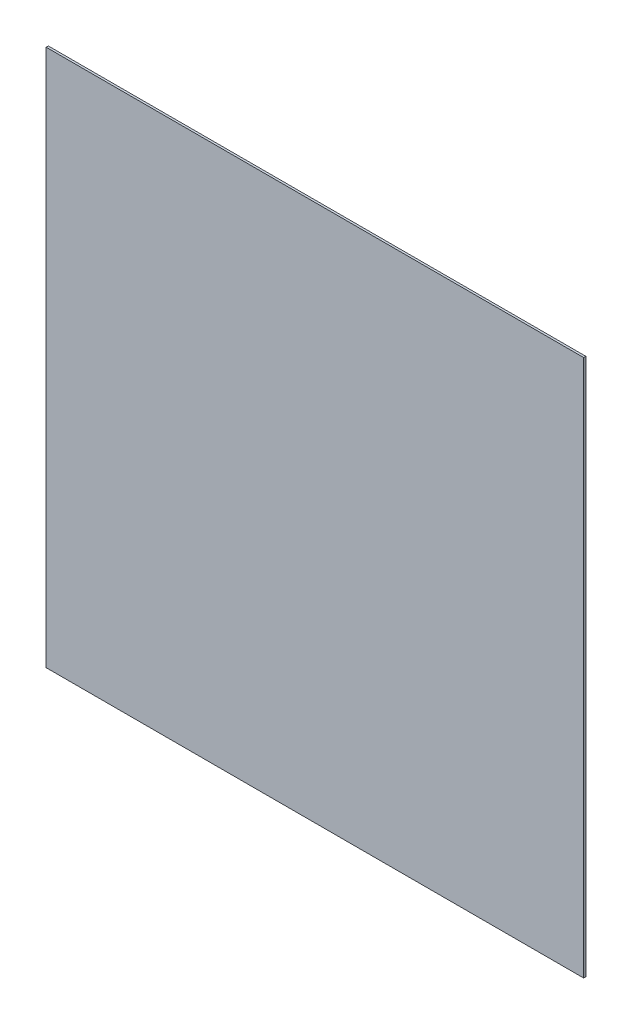
ISO-10303-21;
HEADER;
FILE_DESCRIPTION(('STEP AP214'),'2;1');
FILE_NAME('part.step','',(''),(''),'','','');
FILE_SCHEMA(('AUTOMOTIVE_DESIGN { 1 0 10303 214 1 1 1 1 }'));
ENDSEC;
DATA;
#1=APPLICATION_CONTEXT('core data for automotive mechanical design processes');
#2=APPLICATION_PROTOCOL_DEFINITION('international standard','automotive_design',2000,#1);
#3=PRODUCT_CONTEXT('',#1,'mechanical');
#4=PRODUCT('Part','Part','',(#3));
#5=PRODUCT_RELATED_PRODUCT_CATEGORY('part','',(#4));
#6=PRODUCT_DEFINITION_FORMATION('','',#4);
#7=PRODUCT_DEFINITION_CONTEXT('part definition',#1,'design');
#8=PRODUCT_DEFINITION('design','',#6,#7);
#9=PRODUCT_DEFINITION_SHAPE('','',#8);
#10=(LENGTH_UNIT() NAMED_UNIT(*) SI_UNIT(.MILLI.,.METRE.));
#11=(NAMED_UNIT(*) PLANE_ANGLE_UNIT() SI_UNIT($,.RADIAN.));
#12=(NAMED_UNIT(*) SI_UNIT($,.STERADIAN.) SOLID_ANGLE_UNIT());
#13=UNCERTAINTY_MEASURE_WITH_UNIT(LENGTH_MEASURE(1.E-05),#10,'distance_accuracy_value','');
#14=(GEOMETRIC_REPRESENTATION_CONTEXT(3) GLOBAL_UNCERTAINTY_ASSIGNED_CONTEXT((#13)) GLOBAL_UNIT_ASSIGNED_CONTEXT((#10,
#11,#12)) REPRESENTATION_CONTEXT('',''));
#15=CARTESIAN_POINT('',(0.,0.,0.));
#16=DIRECTION('',(0.,0.,1.));
#17=DIRECTION('',(1.,0.,0.));
#18=AXIS2_PLACEMENT_3D('',#15,#16,#17);
#19=CARTESIAN_POINT('',(-256.013393359467,248.,90.));
#20=DIRECTION('',(0.,1.,0.));
#21=DIRECTION('',(0.,0.,1.));
#22=AXIS2_PLACEMENT_3D('',#19,#20,#21);
#23=PLANE('',#22);
#24=DIRECTION('',(1.,0.,0.));
#25=VECTOR('',#24,1.);
#26=CARTESIAN_POINT('',(0.,248.,88.));
#27=LINE('',#26,#25);
#28=CARTESIAN_POINT('',(-248.,248.,88.));
#29=VERTEX_POINT('',#28);
#30=CARTESIAN_POINT('',(248.,248.,88.));
#31=VERTEX_POINT('',#30);
#32=EDGE_CURVE('E77',#29,#31,#27,.T.);
#33=ORIENTED_EDGE('',*,*,#32,.F.);
#34=DIRECTION('',(0.,0.,1.));
#35=VECTOR('',#34,1.);
#36=CARTESIAN_POINT('',(-248.,248.,-133.832293437024));
#37=LINE('',#36,#35);
#38=CARTESIAN_POINT('',(-248.,248.,90.));
#39=VERTEX_POINT('',#38);
#40=EDGE_CURVE('E35',#29,#39,#37,.T.);
#41=ORIENTED_EDGE('',*,*,#40,.T.);
#42=DIRECTION('',(1.,0.,0.));
#43=VECTOR('',#42,1.);
#44=CARTESIAN_POINT('',(-250.,248.,90.));
#45=LINE('',#44,#43);
#46=CARTESIAN_POINT('',(248.,248.,90.));
#47=VERTEX_POINT('',#46);
#48=EDGE_CURVE('E95',#39,#47,#45,.T.);
#49=ORIENTED_EDGE('',*,*,#48,.T.);
#50=DIRECTION('',(0.,0.,-1.));
#51=VECTOR('',#50,1.);
#52=CARTESIAN_POINT('',(248.,248.,-133.832293437024));
#53=LINE('',#52,#51);
#54=EDGE_CURVE('E81',#47,#31,#53,.T.);
#55=ORIENTED_EDGE('',*,*,#54,.T.);
#56=EDGE_LOOP('',(#33,#41,#49,#55));
#57=FACE_BOUND('',#56,.T.);
#58=ADVANCED_FACE('F32',(#57),#23,.T.);
#59=CARTESIAN_POINT('',(-301.446567486664,-248.,90.));
#60=DIRECTION('',(0.,-1.,0.));
#61=DIRECTION('',(0.,0.,-1.));
#62=AXIS2_PLACEMENT_3D('',#59,#60,#61);
#63=PLANE('',#62);
#64=DIRECTION('',(0.,0.,-1.));
#65=VECTOR('',#64,1.);
#66=CARTESIAN_POINT('',(-248.,-248.,-133.832293437024));
#67=LINE('',#66,#65);
#68=CARTESIAN_POINT('',(-248.,-248.,90.));
#69=VERTEX_POINT('',#68);
#70=CARTESIAN_POINT('',(-248.,-248.,88.));
#71=VERTEX_POINT('',#70);
#72=EDGE_CURVE('E85',#69,#71,#67,.T.);
#73=ORIENTED_EDGE('',*,*,#72,.T.);
#74=DIRECTION('',(1.,0.,0.));
#75=VECTOR('',#74,1.);
#76=CARTESIAN_POINT('',(0.,-248.,88.));
#77=LINE('',#76,#75);
#78=CARTESIAN_POINT('',(248.,-248.,88.));
#79=VERTEX_POINT('',#78);
#80=EDGE_CURVE('E11',#71,#79,#77,.T.);
#81=ORIENTED_EDGE('',*,*,#80,.T.);
#82=DIRECTION('',(0.,0.,1.));
#83=VECTOR('',#82,1.);
#84=CARTESIAN_POINT('',(248.,-248.,-133.832293437024));
#85=LINE('',#84,#83);
#86=CARTESIAN_POINT('',(248.,-248.,90.));
#87=VERTEX_POINT('',#86);
#88=EDGE_CURVE('E97',#79,#87,#85,.T.);
#89=ORIENTED_EDGE('',*,*,#88,.T.);
#90=DIRECTION('',(-1.,0.,0.));
#91=VECTOR('',#90,1.);
#92=CARTESIAN_POINT('',(-250.,-248.,90.));
#93=LINE('',#92,#91);
#94=EDGE_CURVE('E40',#87,#69,#93,.T.);
#95=ORIENTED_EDGE('',*,*,#94,.T.);
#96=EDGE_LOOP('',(#73,#81,#89,#95));
#97=FACE_BOUND('',#96,.T.);
#98=ADVANCED_FACE('F101',(#97),#63,.T.);
#99=CARTESIAN_POINT('',(248.,250.,-133.832293437024));
#100=DIRECTION('',(-1.,0.,0.));
#101=DIRECTION('',(0.,0.,1.));
#102=AXIS2_PLACEMENT_3D('',#99,#100,#101);
#103=PLANE('',#102);
#104=ORIENTED_EDGE('',*,*,#54,.F.);
#105=DIRECTION('',(0.,1.,0.));
#106=VECTOR('',#105,1.);
#107=CARTESIAN_POINT('',(248.,250.,90.));
#108=LINE('',#107,#106);
#109=EDGE_CURVE('E88',#87,#47,#108,.T.);
#110=ORIENTED_EDGE('',*,*,#109,.F.);
#111=ORIENTED_EDGE('',*,*,#88,.F.);
#112=DIRECTION('',(0.,-1.,0.));
#113=VECTOR('',#112,1.);
#114=CARTESIAN_POINT('',(248.,250.,88.));
#115=LINE('',#114,#113);
#116=EDGE_CURVE('E48',#31,#79,#115,.T.);
#117=ORIENTED_EDGE('',*,*,#116,.F.);
#118=EDGE_LOOP('',(#104,#110,#111,#117));
#119=FACE_BOUND('',#118,.T.);
#120=ADVANCED_FACE('F106',(#119),#103,.F.);
#121=CARTESIAN_POINT('',(-248.,250.,-133.832293437024));
#122=DIRECTION('',(1.,0.,0.));
#123=DIRECTION('',(0.,0.,-1.));
#124=AXIS2_PLACEMENT_3D('',#121,#122,#123);
#125=PLANE('',#124);
#126=ORIENTED_EDGE('',*,*,#40,.F.);
#127=DIRECTION('',(0.,-1.,0.));
#128=VECTOR('',#127,1.);
#129=CARTESIAN_POINT('',(-248.,250.,88.));
#130=LINE('',#129,#128);
#131=EDGE_CURVE('E56',#29,#71,#130,.T.);
#132=ORIENTED_EDGE('',*,*,#131,.T.);
#133=ORIENTED_EDGE('',*,*,#72,.F.);
#134=DIRECTION('',(0.,-1.,0.));
#135=VECTOR('',#134,1.);
#136=CARTESIAN_POINT('',(-248.,250.,90.));
#137=LINE('',#136,#135);
#138=EDGE_CURVE('E84',#39,#69,#137,.T.);
#139=ORIENTED_EDGE('',*,*,#138,.F.);
#140=EDGE_LOOP('',(#126,#132,#133,#139));
#141=FACE_BOUND('',#140,.T.);
#142=ADVANCED_FACE('F83',(#141),#125,.F.);
#143=CARTESIAN_POINT('',(-250.,250.,90.));
#144=DIRECTION('',(0.,0.,-1.));
#145=DIRECTION('',(-1.,0.,0.));
#146=AXIS2_PLACEMENT_3D('',#143,#144,#145);
#147=PLANE('',#146);
#148=ORIENTED_EDGE('',*,*,#48,.F.);
#149=ORIENTED_EDGE('',*,*,#138,.T.);
#150=ORIENTED_EDGE('',*,*,#94,.F.);
#151=ORIENTED_EDGE('',*,*,#109,.T.);
#152=EDGE_LOOP('',(#148,#149,#150,#151));
#153=FACE_BOUND('',#152,.T.);
#154=ADVANCED_FACE('F104',(#153),#147,.F.);
#155=CARTESIAN_POINT('',(-250.,250.,88.));
#156=DIRECTION('',(0.,0.,-1.));
#157=DIRECTION('',(-1.,0.,0.));
#158=AXIS2_PLACEMENT_3D('',#155,#156,#157);
#159=PLANE('',#158);
#160=ORIENTED_EDGE('',*,*,#80,.F.);
#161=ORIENTED_EDGE('',*,*,#131,.F.);
#162=ORIENTED_EDGE('',*,*,#32,.T.);
#163=ORIENTED_EDGE('',*,*,#116,.T.);
#164=EDGE_LOOP('',(#160,#161,#162,#163));
#165=FACE_BOUND('',#164,.T.);
#166=ADVANCED_FACE('F86',(#165),#159,.T.);
#167=CLOSED_SHELL('',(#58,#98,#120,#142,#154,#166));
#168=MANIFOLD_SOLID_BREP('B2',#167);
#169=ADVANCED_BREP_SHAPE_REPRESENTATION('',(#18,#168),#14);
#170=SHAPE_DEFINITION_REPRESENTATION(#9,#169);
ENDSEC;
END-ISO-10303-21;
